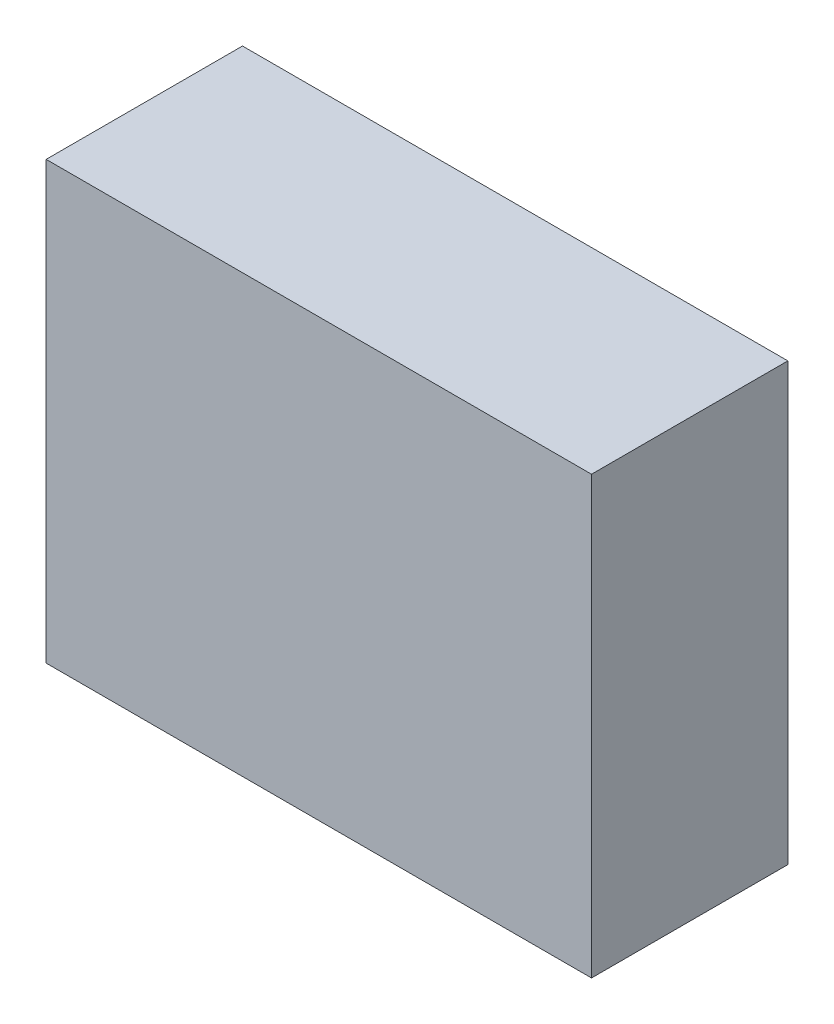
ISO-10303-21;
HEADER;
FILE_DESCRIPTION(('STEP AP214'),'2;1');
FILE_NAME('part.step','',(''),(''),'','','');
FILE_SCHEMA(('AUTOMOTIVE_DESIGN { 1 0 10303 214 1 1 1 1 }'));
ENDSEC;
DATA;
#1=APPLICATION_CONTEXT('core data for automotive mechanical design processes');
#2=APPLICATION_PROTOCOL_DEFINITION('international standard','automotive_design',2000,#1);
#3=PRODUCT_CONTEXT('',#1,'mechanical');
#4=PRODUCT('Part','Part','',(#3));
#5=PRODUCT_RELATED_PRODUCT_CATEGORY('part','',(#4));
#6=PRODUCT_DEFINITION_FORMATION('','',#4);
#7=PRODUCT_DEFINITION_CONTEXT('part definition',#1,'design');
#8=PRODUCT_DEFINITION('design','',#6,#7);
#9=PRODUCT_DEFINITION_SHAPE('','',#8);
#10=(LENGTH_UNIT() NAMED_UNIT(*) SI_UNIT(.MILLI.,.METRE.));
#11=(NAMED_UNIT(*) PLANE_ANGLE_UNIT() SI_UNIT($,.RADIAN.));
#12=(NAMED_UNIT(*) SI_UNIT($,.STERADIAN.) SOLID_ANGLE_UNIT());
#13=UNCERTAINTY_MEASURE_WITH_UNIT(LENGTH_MEASURE(1.E-05),#10,'distance_accuracy_value','');
#14=(GEOMETRIC_REPRESENTATION_CONTEXT(3) GLOBAL_UNCERTAINTY_ASSIGNED_CONTEXT((#13)) GLOBAL_UNIT_ASSIGNED_CONTEXT((#10,
#11,#12)) REPRESENTATION_CONTEXT('',''));
#15=CARTESIAN_POINT('',(0.,0.,0.));
#16=DIRECTION('',(0.,0.,1.));
#17=DIRECTION('',(1.,0.,0.));
#18=AXIS2_PLACEMENT_3D('',#15,#16,#17);
#19=CARTESIAN_POINT('',(-1.25000004,1.00000054,0.90000074));
#20=DIRECTION('',(0.,0.,-1.));
#21=DIRECTION('',(-1.,0.,0.));
#22=AXIS2_PLACEMENT_3D('',#19,#20,#21);
#23=PLANE('',#22);
#24=DIRECTION('',(1.,0.,0.));
#25=VECTOR('',#24,1.);
#26=CARTESIAN_POINT('',(-1.25000004,-1.00000054,0.90000074));
#27=LINE('',#26,#25);
#28=CARTESIAN_POINT('',(-1.25000004,-1.00000054,0.90000074));
#29=VERTEX_POINT('',#28);
#30=CARTESIAN_POINT('',(1.25000004,-1.00000054,0.90000074));
#31=VERTEX_POINT('',#30);
#32=EDGE_CURVE('E54',#29,#31,#27,.T.);
#33=ORIENTED_EDGE('',*,*,#32,.T.);
#34=DIRECTION('',(0.,1.,0.));
#35=VECTOR('',#34,1.);
#36=CARTESIAN_POINT('',(1.25000004,-1.00000054,0.90000074));
#37=LINE('',#36,#35);
#38=CARTESIAN_POINT('',(1.25000004,1.00000054,0.90000074));
#39=VERTEX_POINT('',#38);
#40=EDGE_CURVE('E56',#31,#39,#37,.T.);
#41=ORIENTED_EDGE('',*,*,#40,.T.);
#42=DIRECTION('',(1.,0.,0.));
#43=VECTOR('',#42,1.);
#44=CARTESIAN_POINT('',(1.25000004,1.00000054,0.90000074));
#45=LINE('',#44,#43);
#46=CARTESIAN_POINT('',(-1.25000004,1.00000054,0.90000074));
#47=VERTEX_POINT('',#46);
#48=EDGE_CURVE('E19',#39,#47,#45,.F.);
#49=ORIENTED_EDGE('',*,*,#48,.T.);
#50=DIRECTION('',(0.,1.,0.));
#51=VECTOR('',#50,1.);
#52=CARTESIAN_POINT('',(-1.25000004,1.00000054,0.90000074));
#53=LINE('',#52,#51);
#54=EDGE_CURVE('E79',#47,#29,#53,.F.);
#55=ORIENTED_EDGE('',*,*,#54,.T.);
#56=EDGE_LOOP('',(#33,#41,#49,#55));
#57=FACE_BOUND('',#56,.T.);
#58=ADVANCED_FACE('F16',(#57),#23,.F.);
#59=CARTESIAN_POINT('',(1.25000004,1.00000054,0.));
#60=DIRECTION('',(0.,-1.,0.));
#61=DIRECTION('',(0.,0.,-1.));
#62=AXIS2_PLACEMENT_3D('',#59,#60,#61);
#63=PLANE('',#62);
#64=DIRECTION('',(0.,0.,-1.));
#65=VECTOR('',#64,1.);
#66=CARTESIAN_POINT('',(-1.25000004,1.00000054,0.));
#67=LINE('',#66,#65);
#68=CARTESIAN_POINT('',(-1.25000004,1.00000054,0.));
#69=VERTEX_POINT('',#68);
#70=EDGE_CURVE('E67',#69,#47,#67,.F.);
#71=ORIENTED_EDGE('',*,*,#70,.T.);
#72=ORIENTED_EDGE('',*,*,#48,.F.);
#73=DIRECTION('',(0.,0.,1.));
#74=VECTOR('',#73,1.);
#75=CARTESIAN_POINT('',(1.25000004,1.00000054,0.));
#76=LINE('',#75,#74);
#77=CARTESIAN_POINT('',(1.25000004,1.00000054,0.));
#78=VERTEX_POINT('',#77);
#79=EDGE_CURVE('E62',#39,#78,#76,.F.);
#80=ORIENTED_EDGE('',*,*,#79,.T.);
#81=DIRECTION('',(-1.,0.,0.));
#82=VECTOR('',#81,1.);
#83=CARTESIAN_POINT('',(-1.25000004,1.00000054,0.));
#84=LINE('',#83,#82);
#85=EDGE_CURVE('E82',#69,#78,#84,.F.);
#86=ORIENTED_EDGE('',*,*,#85,.F.);
#87=EDGE_LOOP('',(#71,#72,#80,#86));
#88=FACE_BOUND('',#87,.T.);
#89=ADVANCED_FACE('F64',(#88),#63,.F.);
#90=CARTESIAN_POINT('',(1.25000004,-1.00000054,0.));
#91=DIRECTION('',(-1.,0.,0.));
#92=DIRECTION('',(0.,0.,1.));
#93=AXIS2_PLACEMENT_3D('',#90,#91,#92);
#94=PLANE('',#93);
#95=ORIENTED_EDGE('',*,*,#79,.F.);
#96=ORIENTED_EDGE('',*,*,#40,.F.);
#97=DIRECTION('',(0.,0.,1.));
#98=VECTOR('',#97,1.);
#99=CARTESIAN_POINT('',(1.25000004,-1.00000054,0.));
#100=LINE('',#99,#98);
#101=CARTESIAN_POINT('',(1.25000004,-1.00000054,0.));
#102=VERTEX_POINT('',#101);
#103=EDGE_CURVE('E74',#31,#102,#100,.F.);
#104=ORIENTED_EDGE('',*,*,#103,.T.);
#105=DIRECTION('',(0.,1.,0.));
#106=VECTOR('',#105,1.);
#107=CARTESIAN_POINT('',(1.25000004,1.00000054,0.));
#108=LINE('',#107,#106);
#109=EDGE_CURVE('E71',#78,#102,#108,.F.);
#110=ORIENTED_EDGE('',*,*,#109,.F.);
#111=EDGE_LOOP('',(#95,#96,#104,#110));
#112=FACE_BOUND('',#111,.T.);
#113=ADVANCED_FACE('F69',(#112),#94,.F.);
#114=CARTESIAN_POINT('',(-1.25000004,-1.00000054,0.));
#115=DIRECTION('',(0.,1.,0.));
#116=DIRECTION('',(0.,0.,1.));
#117=AXIS2_PLACEMENT_3D('',#114,#115,#116);
#118=PLANE('',#117);
#119=ORIENTED_EDGE('',*,*,#103,.F.);
#120=ORIENTED_EDGE('',*,*,#32,.F.);
#121=DIRECTION('',(0.,0.,-1.));
#122=VECTOR('',#121,1.);
#123=CARTESIAN_POINT('',(-1.25000004,-1.00000054,0.));
#124=LINE('',#123,#122);
#125=CARTESIAN_POINT('',(-1.25000004,-1.00000054,0.));
#126=VERTEX_POINT('',#125);
#127=EDGE_CURVE('E34',#29,#126,#124,.T.);
#128=ORIENTED_EDGE('',*,*,#127,.T.);
#129=DIRECTION('',(-1.,0.,0.));
#130=VECTOR('',#129,1.);
#131=CARTESIAN_POINT('',(-1.25000004,-1.00000054,0.));
#132=LINE('',#131,#130);
#133=EDGE_CURVE('E25',#102,#126,#132,.T.);
#134=ORIENTED_EDGE('',*,*,#133,.F.);
#135=EDGE_LOOP('',(#119,#120,#128,#134));
#136=FACE_BOUND('',#135,.T.);
#137=ADVANCED_FACE('F88',(#136),#118,.F.);
#138=CARTESIAN_POINT('',(-1.25000004,1.00000054,0.));
#139=DIRECTION('',(1.,0.,0.));
#140=DIRECTION('',(0.,0.,-1.));
#141=AXIS2_PLACEMENT_3D('',#138,#139,#140);
#142=PLANE('',#141);
#143=ORIENTED_EDGE('',*,*,#127,.F.);
#144=ORIENTED_EDGE('',*,*,#54,.F.);
#145=ORIENTED_EDGE('',*,*,#70,.F.);
#146=DIRECTION('',(0.,1.,0.));
#147=VECTOR('',#146,1.);
#148=CARTESIAN_POINT('',(-1.25000004,1.00000054,0.));
#149=LINE('',#148,#147);
#150=EDGE_CURVE('E11',#126,#69,#149,.T.);
#151=ORIENTED_EDGE('',*,*,#150,.F.);
#152=EDGE_LOOP('',(#143,#144,#145,#151));
#153=FACE_BOUND('',#152,.T.);
#154=ADVANCED_FACE('F90',(#153),#142,.F.);
#155=CARTESIAN_POINT('',(-1.25000004,1.00000054,0.));
#156=DIRECTION('',(0.,0.,-1.));
#157=DIRECTION('',(-1.,0.,0.));
#158=AXIS2_PLACEMENT_3D('',#155,#156,#157);
#159=PLANE('',#158);
#160=ORIENTED_EDGE('',*,*,#133,.T.);
#161=ORIENTED_EDGE('',*,*,#150,.T.);
#162=ORIENTED_EDGE('',*,*,#85,.T.);
#163=ORIENTED_EDGE('',*,*,#109,.T.);
#164=EDGE_LOOP('',(#160,#161,#162,#163));
#165=FACE_BOUND('',#164,.T.);
#166=ADVANCED_FACE('F87',(#165),#159,.T.);
#167=CLOSED_SHELL('',(#58,#89,#113,#137,#154,#166));
#168=MANIFOLD_SOLID_BREP('B1',#167);
#169=ADVANCED_BREP_SHAPE_REPRESENTATION('',(#18,#168),#14);
#170=SHAPE_DEFINITION_REPRESENTATION(#9,#169);
ENDSEC;
END-ISO-10303-21;
